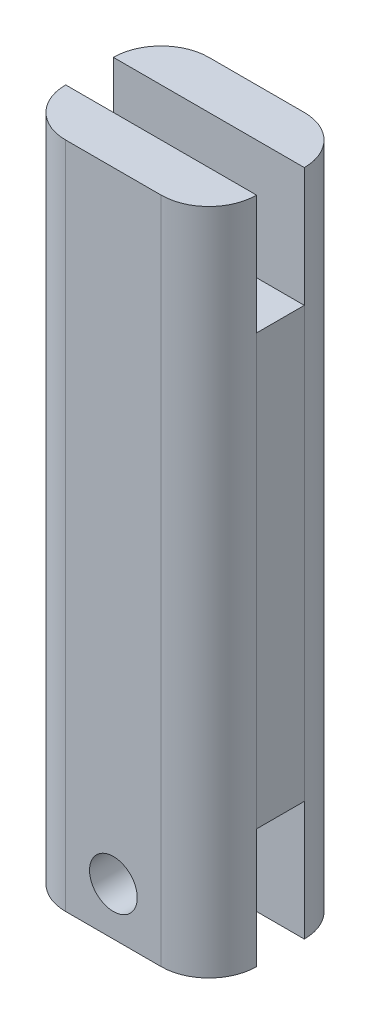
ISO-10303-21;
HEADER;
FILE_DESCRIPTION(('STEP AP214'),'2;1');
FILE_NAME('part.step','',(''),(''),'','','');
FILE_SCHEMA(('AUTOMOTIVE_DESIGN { 1 0 10303 214 1 1 1 1 }'));
ENDSEC;
DATA;
#1=APPLICATION_CONTEXT('core data for automotive mechanical design processes');
#2=APPLICATION_PROTOCOL_DEFINITION('international standard','automotive_design',2000,#1);
#3=PRODUCT_CONTEXT('',#1,'mechanical');
#4=PRODUCT('Part','Part','',(#3));
#5=PRODUCT_RELATED_PRODUCT_CATEGORY('part','',(#4));
#6=PRODUCT_DEFINITION_FORMATION('','',#4);
#7=PRODUCT_DEFINITION_CONTEXT('part definition',#1,'design');
#8=PRODUCT_DEFINITION('design','',#6,#7);
#9=PRODUCT_DEFINITION_SHAPE('','',#8);
#10=(LENGTH_UNIT() NAMED_UNIT(*) SI_UNIT(.MILLI.,.METRE.));
#11=(NAMED_UNIT(*) PLANE_ANGLE_UNIT() SI_UNIT($,.RADIAN.));
#12=(NAMED_UNIT(*) SI_UNIT($,.STERADIAN.) SOLID_ANGLE_UNIT());
#13=UNCERTAINTY_MEASURE_WITH_UNIT(LENGTH_MEASURE(1.E-05),#10,'distance_accuracy_value','');
#14=(GEOMETRIC_REPRESENTATION_CONTEXT(3) GLOBAL_UNCERTAINTY_ASSIGNED_CONTEXT((#13)) GLOBAL_UNIT_ASSIGNED_CONTEXT((#10,
#11,#12)) REPRESENTATION_CONTEXT('',''));
#15=CARTESIAN_POINT('',(0.,0.,0.));
#16=DIRECTION('',(0.,0.,1.));
#17=DIRECTION('',(1.,0.,0.));
#18=AXIS2_PLACEMENT_3D('',#15,#16,#17);
#19=CARTESIAN_POINT('',(0.,35.56,0.));
#20=DIRECTION('',(0.,-1.,0.));
#21=DIRECTION('',(0.,0.,-1.));
#22=AXIS2_PLACEMENT_3D('',#19,#20,#21);
#23=PLANE('',#22);
#24=CARTESIAN_POINT('',(7.62,35.56,-2.54));
#25=DIRECTION('',(0.,-1.,0.));
#26=DIRECTION('',(0.,0.,-1.));
#27=AXIS2_PLACEMENT_3D('',#24,#25,#26);
#28=CIRCLE('',#27,2.54);
#29=CARTESIAN_POINT('',(7.62,35.56,0.));
#30=VERTEX_POINT('',#29);
#31=CARTESIAN_POINT('',(10.16,35.56,-2.54));
#32=VERTEX_POINT('',#31);
#33=EDGE_CURVE('E163',#30,#32,#28,.F.);
#34=ORIENTED_EDGE('',*,*,#33,.T.);
#35=DIRECTION('',(1.,0.,0.));
#36=VECTOR('',#35,1.);
#37=CARTESIAN_POINT('',(10.16,35.56,-2.54));
#38=LINE('',#37,#36);
#39=CARTESIAN_POINT('',(0.,35.56,-2.54));
#40=VERTEX_POINT('',#39);
#41=EDGE_CURVE('E59',#40,#32,#38,.T.);
#42=ORIENTED_EDGE('',*,*,#41,.F.);
#43=CARTESIAN_POINT('',(2.54,35.56,-2.54));
#44=DIRECTION('',(0.,-1.,0.));
#45=DIRECTION('',(0.,0.,-1.));
#46=AXIS2_PLACEMENT_3D('',#43,#44,#45);
#47=CIRCLE('',#46,2.54);
#48=CARTESIAN_POINT('',(2.54,35.56,0.));
#49=VERTEX_POINT('',#48);
#50=EDGE_CURVE('E159',#40,#49,#47,.F.);
#51=ORIENTED_EDGE('',*,*,#50,.T.);
#52=DIRECTION('',(1.,0.,0.));
#53=VECTOR('',#52,1.);
#54=CARTESIAN_POINT('',(0.,35.56,0.));
#55=LINE('',#54,#53);
#56=EDGE_CURVE('E189',#49,#30,#55,.T.);
#57=ORIENTED_EDGE('',*,*,#56,.T.);
#58=EDGE_LOOP('',(#34,#42,#51,#57));
#59=FACE_BOUND('',#58,.T.);
#60=ADVANCED_FACE('F35',(#59),#23,.F.);
#61=CARTESIAN_POINT('',(0.,0.,0.));
#62=DIRECTION('',(0.,-1.,0.));
#63=DIRECTION('',(0.,0.,-1.));
#64=AXIS2_PLACEMENT_3D('',#61,#62,#63);
#65=PLANE('',#64);
#66=CARTESIAN_POINT('',(7.62,0.,-5.08));
#67=DIRECTION('',(0.,-1.,0.));
#68=DIRECTION('',(0.,0.,-1.));
#69=AXIS2_PLACEMENT_3D('',#66,#67,#68);
#70=CIRCLE('',#69,2.54);
#71=CARTESIAN_POINT('',(7.62,0.,-7.62));
#72=VERTEX_POINT('',#71);
#73=CARTESIAN_POINT('',(10.16,0.,-5.07999999999998));
#74=VERTEX_POINT('',#73);
#75=EDGE_CURVE('E175',#72,#74,#70,.T.);
#76=ORIENTED_EDGE('',*,*,#75,.T.);
#77=DIRECTION('',(-1.,0.,0.));
#78=VECTOR('',#77,1.);
#79=CARTESIAN_POINT('',(10.16,0.,-5.07999999999998));
#80=LINE('',#79,#78);
#81=CARTESIAN_POINT('',(0.,0.,-5.07999999999998));
#82=VERTEX_POINT('',#81);
#83=EDGE_CURVE('E206',#74,#82,#80,.T.);
#84=ORIENTED_EDGE('',*,*,#83,.T.);
#85=CARTESIAN_POINT('',(2.54,0.,-5.08));
#86=DIRECTION('',(0.,-1.,0.));
#87=DIRECTION('',(0.,0.,-1.));
#88=AXIS2_PLACEMENT_3D('',#85,#86,#87);
#89=CIRCLE('',#88,2.54);
#90=CARTESIAN_POINT('',(2.54,0.,-7.62));
#91=VERTEX_POINT('',#90);
#92=EDGE_CURVE('E170',#82,#91,#89,.T.);
#93=ORIENTED_EDGE('',*,*,#92,.T.);
#94=DIRECTION('',(-1.,0.,0.));
#95=VECTOR('',#94,1.);
#96=CARTESIAN_POINT('',(0.,0.,-7.62));
#97=LINE('',#96,#95);
#98=EDGE_CURVE('E186',#72,#91,#97,.T.);
#99=ORIENTED_EDGE('',*,*,#98,.F.);
#100=EDGE_LOOP('',(#76,#84,#93,#99));
#101=FACE_BOUND('',#100,.T.);
#102=ADVANCED_FACE('F274',(#101),#65,.T.);
#103=CARTESIAN_POINT('',(2.54,0.,-2.54));
#104=DIRECTION('',(0.,-1.,0.));
#105=DIRECTION('',(0.,0.,-1.));
#106=AXIS2_PLACEMENT_3D('',#103,#104,#105);
#107=CIRCLE('',#106,2.54);
#108=CARTESIAN_POINT('',(2.54,0.,0.));
#109=VERTEX_POINT('',#108);
#110=CARTESIAN_POINT('',(0.,0.,-2.54));
#111=VERTEX_POINT('',#110);
#112=EDGE_CURVE('E172',#109,#111,#107,.T.);
#113=ORIENTED_EDGE('',*,*,#112,.T.);
#114=DIRECTION('',(1.,0.,0.));
#115=VECTOR('',#114,1.);
#116=CARTESIAN_POINT('',(10.16,0.,-2.54));
#117=LINE('',#116,#115);
#118=CARTESIAN_POINT('',(10.16,0.,-2.54));
#119=VERTEX_POINT('',#118);
#120=EDGE_CURVE('E202',#111,#119,#117,.T.);
#121=ORIENTED_EDGE('',*,*,#120,.T.);
#122=CARTESIAN_POINT('',(7.62,0.,-2.54));
#123=DIRECTION('',(0.,-1.,0.));
#124=DIRECTION('',(0.,0.,-1.));
#125=AXIS2_PLACEMENT_3D('',#122,#123,#124);
#126=CIRCLE('',#125,2.54);
#127=CARTESIAN_POINT('',(7.62,0.,0.));
#128=VERTEX_POINT('',#127);
#129=EDGE_CURVE('E178',#119,#128,#126,.T.);
#130=ORIENTED_EDGE('',*,*,#129,.T.);
#131=DIRECTION('',(1.,0.,0.));
#132=VECTOR('',#131,1.);
#133=CARTESIAN_POINT('',(0.,0.,0.));
#134=LINE('',#133,#132);
#135=EDGE_CURVE('E190',#109,#128,#134,.T.);
#136=ORIENTED_EDGE('',*,*,#135,.F.);
#137=EDGE_LOOP('',(#113,#121,#130,#136));
#138=FACE_BOUND('',#137,.T.);
#139=ADVANCED_FACE('F253',(#138),#65,.T.);
#140=CARTESIAN_POINT('',(0.,35.56,0.));
#141=DIRECTION('',(1.,0.,0.));
#142=DIRECTION('',(0.,0.,-1.));
#143=AXIS2_PLACEMENT_3D('',#140,#141,#142);
#144=PLANE('',#143);
#145=DIRECTION('',(0.,-1.,0.));
#146=VECTOR('',#145,1.);
#147=CARTESIAN_POINT('',(0.,35.56,-2.54));
#148=LINE('',#147,#146);
#149=CARTESIAN_POINT('',(0.,6.35,-2.54));
#150=VERTEX_POINT('',#149);
#151=CARTESIAN_POINT('',(0.,29.21,-2.54));
#152=VERTEX_POINT('',#151);
#153=EDGE_CURVE('E185',#150,#152,#148,.F.);
#154=ORIENTED_EDGE('',*,*,#153,.T.);
#155=DIRECTION('',(0.,0.,1.));
#156=VECTOR('',#155,1.);
#157=CARTESIAN_POINT('',(0.,29.21,-2.54));
#158=LINE('',#157,#156);
#159=CARTESIAN_POINT('',(0.,29.21,-5.07999999999998));
#160=VERTEX_POINT('',#159);
#161=EDGE_CURVE('E139',#160,#152,#158,.T.);
#162=ORIENTED_EDGE('',*,*,#161,.F.);
#163=DIRECTION('',(0.,-1.,0.));
#164=VECTOR('',#163,1.);
#165=CARTESIAN_POINT('',(0.,35.56,-5.08));
#166=LINE('',#165,#164);
#167=CARTESIAN_POINT('',(0.,6.35,-5.07999999999998));
#168=VERTEX_POINT('',#167);
#169=EDGE_CURVE('E182',#160,#168,#166,.T.);
#170=ORIENTED_EDGE('',*,*,#169,.T.);
#171=DIRECTION('',(0.,0.,1.));
#172=VECTOR('',#171,1.);
#173=CARTESIAN_POINT('',(0.,6.35,-2.54));
#174=LINE('',#173,#172);
#175=EDGE_CURVE('E212',#168,#150,#174,.T.);
#176=ORIENTED_EDGE('',*,*,#175,.T.);
#177=EDGE_LOOP('',(#154,#162,#170,#176));
#178=FACE_BOUND('',#177,.T.);
#179=ADVANCED_FACE('F261',(#178),#144,.F.);
#180=CARTESIAN_POINT('',(0.,35.56,0.));
#181=DIRECTION('',(0.,0.,-1.));
#182=DIRECTION('',(-1.,0.,0.));
#183=AXIS2_PLACEMENT_3D('',#180,#181,#182);
#184=PLANE('',#183);
#185=CARTESIAN_POINT('',(5.08,2.54,0.));
#186=DIRECTION('',(0.,0.,-1.));
#187=DIRECTION('',(-1.,0.,0.));
#188=AXIS2_PLACEMENT_3D('',#185,#186,#187);
#189=CIRCLE('',#188,1.27);
#190=CARTESIAN_POINT('',(3.81,2.54,0.));
#191=VERTEX_POINT('',#190);
#192=EDGE_CURVE('E225',#191,#191,#189,.T.);
#193=ORIENTED_EDGE('',*,*,#192,.T.);
#194=EDGE_LOOP('',(#193));
#195=FACE_BOUND('',#194,.T.);
#196=ORIENTED_EDGE('',*,*,#56,.F.);
#197=DIRECTION('',(0.,-1.,0.));
#198=VECTOR('',#197,1.);
#199=CARTESIAN_POINT('',(2.54,35.56,0.));
#200=LINE('',#199,#198);
#201=EDGE_CURVE('E150',#49,#109,#200,.T.);
#202=ORIENTED_EDGE('',*,*,#201,.T.);
#203=ORIENTED_EDGE('',*,*,#135,.T.);
#204=DIRECTION('',(0.,-1.,0.));
#205=VECTOR('',#204,1.);
#206=CARTESIAN_POINT('',(7.62,35.56,0.));
#207=LINE('',#206,#205);
#208=EDGE_CURVE('E152',#128,#30,#207,.F.);
#209=ORIENTED_EDGE('',*,*,#208,.T.);
#210=EDGE_LOOP('',(#196,#202,#203,#209));
#211=FACE_BOUND('',#210,.T.);
#212=ADVANCED_FACE('F297',(#195,#211),#184,.F.);
#213=CARTESIAN_POINT('',(10.16,35.56,0.));
#214=DIRECTION('',(-1.,0.,0.));
#215=DIRECTION('',(0.,0.,1.));
#216=AXIS2_PLACEMENT_3D('',#213,#214,#215);
#217=PLANE('',#216);
#218=DIRECTION('',(0.,-1.,0.));
#219=VECTOR('',#218,1.);
#220=CARTESIAN_POINT('',(10.16,35.56,-5.08));
#221=LINE('',#220,#219);
#222=CARTESIAN_POINT('',(10.16,6.35,-5.07999999999998));
#223=VERTEX_POINT('',#222);
#224=CARTESIAN_POINT('',(10.16,29.21,-5.07999999999998));
#225=VERTEX_POINT('',#224);
#226=EDGE_CURVE('E44',#223,#225,#221,.F.);
#227=ORIENTED_EDGE('',*,*,#226,.T.);
#228=DIRECTION('',(0.,0.,-1.));
#229=VECTOR('',#228,1.);
#230=CARTESIAN_POINT('',(10.16,29.21,-2.54));
#231=LINE('',#230,#229);
#232=CARTESIAN_POINT('',(10.16,29.21,-2.54));
#233=VERTEX_POINT('',#232);
#234=EDGE_CURVE('E136',#233,#225,#231,.T.);
#235=ORIENTED_EDGE('',*,*,#234,.F.);
#236=DIRECTION('',(0.,-1.,0.));
#237=VECTOR('',#236,1.);
#238=CARTESIAN_POINT('',(10.16,35.56,-2.54));
#239=LINE('',#238,#237);
#240=CARTESIAN_POINT('',(10.16,6.35,-2.54));
#241=VERTEX_POINT('',#240);
#242=EDGE_CURVE('E51',#233,#241,#239,.T.);
#243=ORIENTED_EDGE('',*,*,#242,.T.);
#244=DIRECTION('',(0.,0.,-1.));
#245=VECTOR('',#244,1.);
#246=CARTESIAN_POINT('',(10.16,6.35,-2.54));
#247=LINE('',#246,#245);
#248=EDGE_CURVE('E205',#241,#223,#247,.T.);
#249=ORIENTED_EDGE('',*,*,#248,.T.);
#250=EDGE_LOOP('',(#227,#235,#243,#249));
#251=FACE_BOUND('',#250,.T.);
#252=ADVANCED_FACE('F143',(#251),#217,.F.);
#253=CARTESIAN_POINT('',(0.,35.56,-7.62));
#254=DIRECTION('',(0.,0.,1.));
#255=DIRECTION('',(1.,0.,0.));
#256=AXIS2_PLACEMENT_3D('',#253,#254,#255);
#257=PLANE('',#256);
#258=CARTESIAN_POINT('',(5.08,2.54,-7.62));
#259=DIRECTION('',(0.,0.,1.));
#260=DIRECTION('',(1.,0.,0.));
#261=AXIS2_PLACEMENT_3D('',#258,#259,#260);
#262=CIRCLE('',#261,1.27);
#263=CARTESIAN_POINT('',(6.35,2.54,-7.62));
#264=VERTEX_POINT('',#263);
#265=EDGE_CURVE('E233',#264,#264,#262,.T.);
#266=ORIENTED_EDGE('',*,*,#265,.T.);
#267=EDGE_LOOP('',(#266));
#268=FACE_BOUND('',#267,.T.);
#269=ORIENTED_EDGE('',*,*,#98,.T.);
#270=DIRECTION('',(0.,-1.,0.));
#271=VECTOR('',#270,1.);
#272=CARTESIAN_POINT('',(2.54,35.56,-7.62));
#273=LINE('',#272,#271);
#274=CARTESIAN_POINT('',(2.54,35.56,-7.62));
#275=VERTEX_POINT('',#274);
#276=EDGE_CURVE('E165',#91,#275,#273,.F.);
#277=ORIENTED_EDGE('',*,*,#276,.T.);
#278=DIRECTION('',(-1.,0.,0.));
#279=VECTOR('',#278,1.);
#280=CARTESIAN_POINT('',(0.,35.56,-7.62));
#281=LINE('',#280,#279);
#282=CARTESIAN_POINT('',(7.62,35.56,-7.62));
#283=VERTEX_POINT('',#282);
#284=EDGE_CURVE('E194',#283,#275,#281,.T.);
#285=ORIENTED_EDGE('',*,*,#284,.F.);
#286=DIRECTION('',(0.,-1.,0.));
#287=VECTOR('',#286,1.);
#288=CARTESIAN_POINT('',(7.62,35.56,-7.62));
#289=LINE('',#288,#287);
#290=EDGE_CURVE('E167',#283,#72,#289,.T.);
#291=ORIENTED_EDGE('',*,*,#290,.T.);
#292=EDGE_LOOP('',(#269,#277,#285,#291));
#293=FACE_BOUND('',#292,.T.);
#294=ADVANCED_FACE('F289',(#268,#293),#257,.F.);
#295=CARTESIAN_POINT('',(2.54,35.56,-5.08));
#296=DIRECTION('',(0.,-1.,0.));
#297=DIRECTION('',(0.,0.,-1.));
#298=AXIS2_PLACEMENT_3D('',#295,#296,#297);
#299=CIRCLE('',#298,2.54);
#300=CARTESIAN_POINT('',(0.,35.56,-5.07999999999998));
#301=VERTEX_POINT('',#300);
#302=EDGE_CURVE('E156',#275,#301,#299,.F.);
#303=ORIENTED_EDGE('',*,*,#302,.T.);
#304=DIRECTION('',(-1.,0.,0.));
#305=VECTOR('',#304,1.);
#306=CARTESIAN_POINT('',(10.16,35.56,-5.07999999999998));
#307=LINE('',#306,#305);
#308=CARTESIAN_POINT('',(10.16,35.56,-5.07999999999998));
#309=VERTEX_POINT('',#308);
#310=EDGE_CURVE('E145',#309,#301,#307,.T.);
#311=ORIENTED_EDGE('',*,*,#310,.F.);
#312=CARTESIAN_POINT('',(7.62,35.56,-5.08));
#313=DIRECTION('',(0.,-1.,0.));
#314=DIRECTION('',(0.,0.,-1.));
#315=AXIS2_PLACEMENT_3D('',#312,#313,#314);
#316=CIRCLE('',#315,2.54);
#317=EDGE_CURVE('E161',#309,#283,#316,.F.);
#318=ORIENTED_EDGE('',*,*,#317,.T.);
#319=ORIENTED_EDGE('',*,*,#284,.T.);
#320=EDGE_LOOP('',(#303,#311,#318,#319));
#321=FACE_BOUND('',#320,.T.);
#322=ADVANCED_FACE('F286',(#321),#23,.F.);
#323=CARTESIAN_POINT('',(2.54,35.56,-5.08));
#324=DIRECTION('',(0.,-1.,0.));
#325=DIRECTION('',(0.,0.,-1.));
#326=AXIS2_PLACEMENT_3D('',#323,#324,#325);
#327=CYLINDRICAL_SURFACE('',#326,2.54);
#328=ORIENTED_EDGE('',*,*,#302,.F.);
#329=ORIENTED_EDGE('',*,*,#276,.F.);
#330=ORIENTED_EDGE('',*,*,#92,.F.);
#331=DIRECTION('',(0.,-1.,0.));
#332=VECTOR('',#331,1.);
#333=CARTESIAN_POINT('',(0.,6.35,-5.07999999999998));
#334=LINE('',#333,#332);
#335=EDGE_CURVE('E193',#168,#82,#334,.T.);
#336=ORIENTED_EDGE('',*,*,#335,.F.);
#337=ORIENTED_EDGE('',*,*,#169,.F.);
#338=EDGE_CURVE('E180',#301,#160,#166,.T.);
#339=ORIENTED_EDGE('',*,*,#338,.F.);
#340=EDGE_LOOP('',(#328,#329,#330,#336,#337,#339));
#341=FACE_BOUND('',#340,.T.);
#342=ADVANCED_FACE('F269',(#341),#327,.T.);
#343=CARTESIAN_POINT('',(2.54,35.56,-2.54));
#344=DIRECTION('',(0.,-1.,0.));
#345=DIRECTION('',(0.,0.,-1.));
#346=AXIS2_PLACEMENT_3D('',#343,#344,#345);
#347=CYLINDRICAL_SURFACE('',#346,2.54);
#348=ORIENTED_EDGE('',*,*,#50,.F.);
#349=DIRECTION('',(0.,1.,0.));
#350=VECTOR('',#349,1.);
#351=CARTESIAN_POINT('',(0.,29.21,-2.54));
#352=LINE('',#351,#350);
#353=EDGE_CURVE('E209',#152,#40,#352,.T.);
#354=ORIENTED_EDGE('',*,*,#353,.F.);
#355=ORIENTED_EDGE('',*,*,#153,.F.);
#356=EDGE_CURVE('E183',#111,#150,#148,.F.);
#357=ORIENTED_EDGE('',*,*,#356,.F.);
#358=ORIENTED_EDGE('',*,*,#112,.F.);
#359=ORIENTED_EDGE('',*,*,#201,.F.);
#360=EDGE_LOOP('',(#348,#354,#355,#357,#358,#359));
#361=FACE_BOUND('',#360,.T.);
#362=ADVANCED_FACE('F258',(#361),#347,.T.);
#363=CARTESIAN_POINT('',(7.62,35.56,-5.08));
#364=DIRECTION('',(0.,-1.,0.));
#365=DIRECTION('',(0.,0.,-1.));
#366=AXIS2_PLACEMENT_3D('',#363,#364,#365);
#367=CYLINDRICAL_SURFACE('',#366,2.54);
#368=ORIENTED_EDGE('',*,*,#317,.F.);
#369=DIRECTION('',(0.,1.,0.));
#370=VECTOR('',#369,1.);
#371=CARTESIAN_POINT('',(10.16,29.21,-5.07999999999998));
#372=LINE('',#371,#370);
#373=EDGE_CURVE('E220',#225,#309,#372,.T.);
#374=ORIENTED_EDGE('',*,*,#373,.F.);
#375=ORIENTED_EDGE('',*,*,#226,.F.);
#376=EDGE_CURVE('E11',#74,#223,#221,.F.);
#377=ORIENTED_EDGE('',*,*,#376,.F.);
#378=ORIENTED_EDGE('',*,*,#75,.F.);
#379=ORIENTED_EDGE('',*,*,#290,.F.);
#380=EDGE_LOOP('',(#368,#374,#375,#377,#378,#379));
#381=FACE_BOUND('',#380,.T.);
#382=ADVANCED_FACE('F280',(#381),#367,.T.);
#383=CARTESIAN_POINT('',(7.62,35.56,-2.54));
#384=DIRECTION('',(0.,-1.,0.));
#385=DIRECTION('',(0.,0.,-1.));
#386=AXIS2_PLACEMENT_3D('',#383,#384,#385);
#387=CYLINDRICAL_SURFACE('',#386,2.54);
#388=ORIENTED_EDGE('',*,*,#33,.F.);
#389=ORIENTED_EDGE('',*,*,#208,.F.);
#390=ORIENTED_EDGE('',*,*,#129,.F.);
#391=DIRECTION('',(0.,-1.,0.));
#392=VECTOR('',#391,1.);
#393=CARTESIAN_POINT('',(10.16,6.35,-2.54));
#394=LINE('',#393,#392);
#395=EDGE_CURVE('E149',#241,#119,#394,.T.);
#396=ORIENTED_EDGE('',*,*,#395,.F.);
#397=ORIENTED_EDGE('',*,*,#242,.F.);
#398=EDGE_CURVE('E125',#32,#233,#239,.T.);
#399=ORIENTED_EDGE('',*,*,#398,.F.);
#400=EDGE_LOOP('',(#388,#389,#390,#396,#397,#399));
#401=FACE_BOUND('',#400,.T.);
#402=ADVANCED_FACE('F37',(#401),#387,.T.);
#403=CARTESIAN_POINT('',(10.16,6.35,-5.07999999999998));
#404=DIRECTION('',(0.,0.,1.));
#405=DIRECTION('',(1.,0.,0.));
#406=AXIS2_PLACEMENT_3D('',#403,#404,#405);
#407=PLANE('',#406);
#408=CARTESIAN_POINT('',(5.08,2.54,-5.07999999999998));
#409=DIRECTION('',(0.,0.,1.));
#410=DIRECTION('',(1.,0.,0.));
#411=AXIS2_PLACEMENT_3D('',#408,#409,#410);
#412=CIRCLE('',#411,1.27);
#413=CARTESIAN_POINT('',(6.35,2.54,-5.07999999999998));
#414=VERTEX_POINT('',#413);
#415=EDGE_CURVE('E230',#414,#414,#412,.T.);
#416=ORIENTED_EDGE('',*,*,#415,.F.);
#417=EDGE_LOOP('',(#416));
#418=FACE_BOUND('',#417,.T.);
#419=ORIENTED_EDGE('',*,*,#83,.F.);
#420=ORIENTED_EDGE('',*,*,#376,.T.);
#421=DIRECTION('',(-1.,0.,0.));
#422=VECTOR('',#421,1.);
#423=CARTESIAN_POINT('',(10.16,6.35,-5.07999999999998));
#424=LINE('',#423,#422);
#425=EDGE_CURVE('E215',#223,#168,#424,.T.);
#426=ORIENTED_EDGE('',*,*,#425,.T.);
#427=ORIENTED_EDGE('',*,*,#335,.T.);
#428=EDGE_LOOP('',(#419,#420,#426,#427));
#429=FACE_BOUND('',#428,.T.);
#430=ADVANCED_FACE('F247',(#418,#429),#407,.T.);
#431=CARTESIAN_POINT('',(10.16,6.35,-2.54));
#432=DIRECTION('',(0.,0.,-1.));
#433=DIRECTION('',(-1.,0.,0.));
#434=AXIS2_PLACEMENT_3D('',#431,#432,#433);
#435=PLANE('',#434);
#436=CARTESIAN_POINT('',(5.08,2.54,-2.54));
#437=DIRECTION('',(0.,0.,-1.));
#438=DIRECTION('',(-1.,0.,0.));
#439=AXIS2_PLACEMENT_3D('',#436,#437,#438);
#440=CIRCLE('',#439,1.27);
#441=CARTESIAN_POINT('',(3.81,2.54,-2.54));
#442=VERTEX_POINT('',#441);
#443=EDGE_CURVE('E39',#442,#442,#440,.T.);
#444=ORIENTED_EDGE('',*,*,#443,.F.);
#445=EDGE_LOOP('',(#444));
#446=FACE_BOUND('',#445,.T.);
#447=ORIENTED_EDGE('',*,*,#120,.F.);
#448=ORIENTED_EDGE('',*,*,#356,.T.);
#449=DIRECTION('',(1.,0.,0.));
#450=VECTOR('',#449,1.);
#451=CARTESIAN_POINT('',(10.16,6.35,-2.54));
#452=LINE('',#451,#450);
#453=EDGE_CURVE('E201',#150,#241,#452,.T.);
#454=ORIENTED_EDGE('',*,*,#453,.T.);
#455=ORIENTED_EDGE('',*,*,#395,.T.);
#456=EDGE_LOOP('',(#447,#448,#454,#455));
#457=FACE_BOUND('',#456,.T.);
#458=ADVANCED_FACE('F243',(#446,#457),#435,.T.);
#459=CARTESIAN_POINT('',(0.,6.35,0.));
#460=DIRECTION('',(0.,1.,0.));
#461=DIRECTION('',(0.,0.,1.));
#462=AXIS2_PLACEMENT_3D('',#459,#460,#461);
#463=PLANE('',#462);
#464=ORIENTED_EDGE('',*,*,#248,.F.);
#465=ORIENTED_EDGE('',*,*,#453,.F.);
#466=ORIENTED_EDGE('',*,*,#175,.F.);
#467=ORIENTED_EDGE('',*,*,#425,.F.);
#468=EDGE_LOOP('',(#464,#465,#466,#467));
#469=FACE_BOUND('',#468,.T.);
#470=ADVANCED_FACE('F246',(#469),#463,.F.);
#471=CARTESIAN_POINT('',(10.16,29.21,-2.54));
#472=DIRECTION('',(0.,0.,1.));
#473=DIRECTION('',(1.,0.,0.));
#474=AXIS2_PLACEMENT_3D('',#471,#472,#473);
#475=PLANE('',#474);
#476=ORIENTED_EDGE('',*,*,#41,.T.);
#477=ORIENTED_EDGE('',*,*,#398,.T.);
#478=DIRECTION('',(1.,0.,0.));
#479=VECTOR('',#478,1.);
#480=CARTESIAN_POINT('',(10.16,29.21,-2.54));
#481=LINE('',#480,#479);
#482=EDGE_CURVE('E128',#152,#233,#481,.T.);
#483=ORIENTED_EDGE('',*,*,#482,.F.);
#484=ORIENTED_EDGE('',*,*,#353,.T.);
#485=EDGE_LOOP('',(#476,#477,#483,#484));
#486=FACE_BOUND('',#485,.T.);
#487=ADVANCED_FACE('F127',(#486),#475,.F.);
#488=CARTESIAN_POINT('',(10.16,29.21,-5.07999999999998));
#489=DIRECTION('',(0.,0.,-1.));
#490=DIRECTION('',(-1.,0.,0.));
#491=AXIS2_PLACEMENT_3D('',#488,#489,#490);
#492=PLANE('',#491);
#493=ORIENTED_EDGE('',*,*,#310,.T.);
#494=ORIENTED_EDGE('',*,*,#338,.T.);
#495=DIRECTION('',(-1.,0.,0.));
#496=VECTOR('',#495,1.);
#497=CARTESIAN_POINT('',(10.16,29.21,-5.07999999999998));
#498=LINE('',#497,#496);
#499=EDGE_CURVE('E222',#225,#160,#498,.T.);
#500=ORIENTED_EDGE('',*,*,#499,.F.);
#501=ORIENTED_EDGE('',*,*,#373,.T.);
#502=EDGE_LOOP('',(#493,#494,#500,#501));
#503=FACE_BOUND('',#502,.T.);
#504=ADVANCED_FACE('F284',(#503),#492,.F.);
#505=CARTESIAN_POINT('',(0.,29.21,0.));
#506=DIRECTION('',(0.,-1.,0.));
#507=DIRECTION('',(0.,0.,1.));
#508=AXIS2_PLACEMENT_3D('',#505,#506,#507);
#509=PLANE('',#508);
#510=ORIENTED_EDGE('',*,*,#234,.T.);
#511=ORIENTED_EDGE('',*,*,#499,.T.);
#512=ORIENTED_EDGE('',*,*,#161,.T.);
#513=ORIENTED_EDGE('',*,*,#482,.T.);
#514=EDGE_LOOP('',(#510,#511,#512,#513));
#515=FACE_BOUND('',#514,.T.);
#516=ADVANCED_FACE('F134',(#515),#509,.F.);
#517=CARTESIAN_POINT('',(5.08,2.54,-7.62));
#518=DIRECTION('',(0.,0.,1.));
#519=DIRECTION('',(1.,0.,0.));
#520=AXIS2_PLACEMENT_3D('',#517,#518,#519);
#521=CYLINDRICAL_SURFACE('',#520,1.27);
#522=ORIENTED_EDGE('',*,*,#443,.T.);
#523=EDGE_LOOP('',(#522));
#524=FACE_BOUND('',#523,.T.);
#525=ORIENTED_EDGE('',*,*,#192,.F.);
#526=EDGE_LOOP('',(#525));
#527=FACE_BOUND('',#526,.T.);
#528=ADVANCED_FACE('F240',(#524,#527),#521,.F.);
#529=ORIENTED_EDGE('',*,*,#415,.T.);
#530=EDGE_LOOP('',(#529));
#531=FACE_BOUND('',#530,.T.);
#532=ORIENTED_EDGE('',*,*,#265,.F.);
#533=EDGE_LOOP('',(#532));
#534=FACE_BOUND('',#533,.T.);
#535=ADVANCED_FACE('F318',(#531,#534),#521,.F.);
#536=CLOSED_SHELL('',(#60,#102,#139,#179,#212,#252,#294,#322,#342,#362,#382,#402,#430,#458,#470,
#487,#504,#516,#528,#535));
#537=MANIFOLD_SOLID_BREP('B2',#536);
#538=ADVANCED_BREP_SHAPE_REPRESENTATION('',(#18,#537),#14);
#539=SHAPE_DEFINITION_REPRESENTATION(#9,#538);
ENDSEC;
END-ISO-10303-21;
